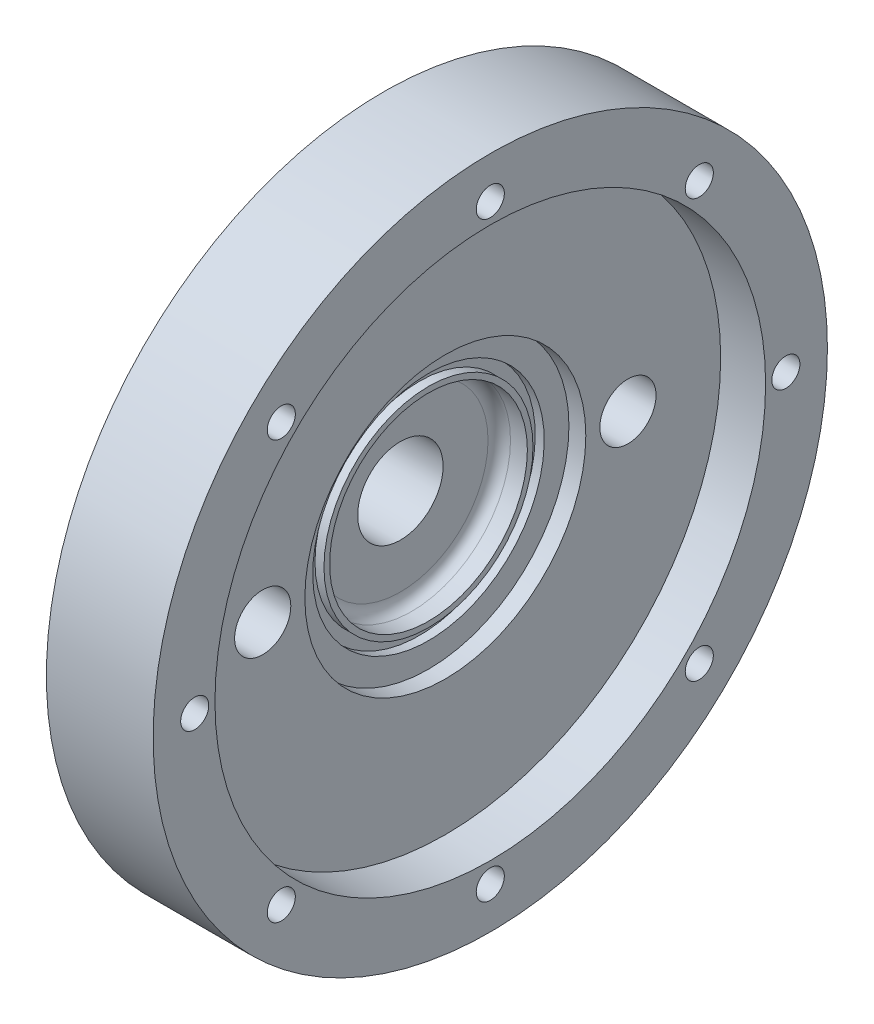
ISO-10303-21;
HEADER;
FILE_DESCRIPTION(('STEP AP214'),'2;1');
FILE_NAME('part.step','',(''),(''),'','','');
FILE_SCHEMA(('AUTOMOTIVE_DESIGN { 1 0 10303 214 1 1 1 1 }'));
ENDSEC;
DATA;
#1=APPLICATION_CONTEXT('core data for automotive mechanical design processes');
#2=APPLICATION_PROTOCOL_DEFINITION('international standard','automotive_design',2000,#1);
#3=PRODUCT_CONTEXT('',#1,'mechanical');
#4=PRODUCT('Part','Part','',(#3));
#5=PRODUCT_RELATED_PRODUCT_CATEGORY('part','',(#4));
#6=PRODUCT_DEFINITION_FORMATION('','',#4);
#7=PRODUCT_DEFINITION_CONTEXT('part definition',#1,'design');
#8=PRODUCT_DEFINITION('design','',#6,#7);
#9=PRODUCT_DEFINITION_SHAPE('','',#8);
#10=(LENGTH_UNIT() NAMED_UNIT(*) SI_UNIT(.MILLI.,.METRE.));
#11=(NAMED_UNIT(*) PLANE_ANGLE_UNIT() SI_UNIT($,.RADIAN.));
#12=(NAMED_UNIT(*) SI_UNIT($,.STERADIAN.) SOLID_ANGLE_UNIT());
#13=UNCERTAINTY_MEASURE_WITH_UNIT(LENGTH_MEASURE(1.E-05),#10,'distance_accuracy_value','');
#14=(GEOMETRIC_REPRESENTATION_CONTEXT(3) GLOBAL_UNCERTAINTY_ASSIGNED_CONTEXT((#13)) GLOBAL_UNIT_ASSIGNED_CONTEXT((#10,
#11,#12)) REPRESENTATION_CONTEXT('',''));
#15=CARTESIAN_POINT('',(0.,0.,0.));
#16=DIRECTION('',(0.,0.,1.));
#17=DIRECTION('',(1.,0.,0.));
#18=AXIS2_PLACEMENT_3D('',#15,#16,#17);
#19=CARTESIAN_POINT('',(3.81,0.,0.));
#20=DIRECTION('',(1.,0.,0.));
#21=DIRECTION('',(0.,0.,-1.));
#22=AXIS2_PLACEMENT_3D('',#19,#20,#21);
#23=PLANE('',#22);
#24=CARTESIAN_POINT('',(3.81,0.,-41.275));
#25=DIRECTION('',(1.,0.,0.));
#26=DIRECTION('',(0.,0.,-1.));
#27=AXIS2_PLACEMENT_3D('',#24,#25,#26);
#28=CIRCLE('',#27,6.35);
#29=CARTESIAN_POINT('',(3.81,0.,-47.625));
#30=VERTEX_POINT('',#29);
#31=EDGE_CURVE('E67',#30,#30,#28,.T.);
#32=ORIENTED_EDGE('',*,*,#31,.F.);
#33=EDGE_LOOP('',(#32));
#34=FACE_BOUND('',#33,.T.);
#35=CARTESIAN_POINT('',(3.81,0.,41.275));
#36=DIRECTION('',(1.,0.,0.));
#37=DIRECTION('',(0.,0.,-1.));
#38=AXIS2_PLACEMENT_3D('',#35,#36,#37);
#39=CIRCLE('',#38,6.35);
#40=CARTESIAN_POINT('',(3.81,0.,34.925));
#41=VERTEX_POINT('',#40);
#42=EDGE_CURVE('E51',#41,#41,#39,.T.);
#43=ORIENTED_EDGE('',*,*,#42,.F.);
#44=EDGE_LOOP('',(#43));
#45=FACE_BOUND('',#44,.T.);
#46=CARTESIAN_POINT('',(3.81,0.,0.));
#47=DIRECTION('',(1.,0.,0.));
#48=DIRECTION('',(0.,0.,-1.));
#49=AXIS2_PLACEMENT_3D('',#46,#47,#48);
#50=CIRCLE('',#49,31.75);
#51=CARTESIAN_POINT('',(3.81,0.,31.75));
#52=VERTEX_POINT('',#51);
#53=EDGE_CURVE('E77',#52,#52,#50,.T.);
#54=ORIENTED_EDGE('',*,*,#53,.F.);
#55=EDGE_LOOP('',(#54));
#56=FACE_BOUND('',#55,.T.);
#57=CARTESIAN_POINT('',(3.81,0.,0.));
#58=DIRECTION('',(1.,0.,0.));
#59=DIRECTION('',(0.,0.,-1.));
#60=AXIS2_PLACEMENT_3D('',#57,#58,#59);
#61=CIRCLE('',#60,62.23);
#62=CARTESIAN_POINT('',(3.81,0.,-62.23));
#63=VERTEX_POINT('',#62);
#64=EDGE_CURVE('E10',#63,#63,#61,.F.);
#65=ORIENTED_EDGE('',*,*,#64,.F.);
#66=EDGE_LOOP('',(#65));
#67=FACE_BOUND('',#66,.T.);
#68=ADVANCED_FACE('F33',(#34,#45,#56,#67),#23,.T.);
#69=CARTESIAN_POINT('',(0.,22.352,0.));
#70=DIRECTION('',(1.,0.,0.));
#71=DIRECTION('',(0.,0.,-1.));
#72=AXIS2_PLACEMENT_3D('',#69,#70,#71);
#73=PLANE('',#72);
#74=CARTESIAN_POINT('',(0.,0.,0.));
#75=DIRECTION('',(1.,0.,0.));
#76=DIRECTION('',(0.,1.,0.));
#77=AXIS2_PLACEMENT_3D('',#74,#75,#76);
#78=CIRCLE('',#77,26.162);
#79=CARTESIAN_POINT('',(0.,26.162,0.));
#80=VERTEX_POINT('',#79);
#81=EDGE_CURVE('E91',#80,#80,#78,.T.);
#82=ORIENTED_EDGE('',*,*,#81,.F.);
#83=EDGE_LOOP('',(#82));
#84=FACE_BOUND('',#83,.T.);
#85=CARTESIAN_POINT('',(0.,0.,0.));
#86=DIRECTION('',(1.,0.,0.));
#87=DIRECTION('',(0.,0.,-1.));
#88=AXIS2_PLACEMENT_3D('',#85,#86,#87);
#89=CIRCLE('',#88,31.75);
#90=CARTESIAN_POINT('',(0.,0.,31.75));
#91=VERTEX_POINT('',#90);
#92=EDGE_CURVE('E76',#91,#91,#89,.T.);
#93=ORIENTED_EDGE('',*,*,#92,.T.);
#94=EDGE_LOOP('',(#93));
#95=FACE_BOUND('',#94,.T.);
#96=ADVANCED_FACE('F35',(#84,#95),#73,.T.);
#97=CARTESIAN_POINT('',(0.,0.,0.));
#98=DIRECTION('',(1.,0.,0.));
#99=DIRECTION('',(0.,0.,-1.));
#100=AXIS2_PLACEMENT_3D('',#97,#98,#99);
#101=CIRCLE('',#100,22.352);
#102=CARTESIAN_POINT('',(0.,0.,-22.352));
#103=VERTEX_POINT('',#102);
#104=EDGE_CURVE('E41',#103,#103,#101,.T.);
#105=ORIENTED_EDGE('',*,*,#104,.F.);
#106=EDGE_LOOP('',(#105));
#107=FACE_BOUND('',#106,.T.);
#108=CARTESIAN_POINT('',(0.,0.,0.));
#109=DIRECTION('',(1.,0.,0.));
#110=DIRECTION('',(0.,1.,0.));
#111=AXIS2_PLACEMENT_3D('',#108,#109,#110);
#112=CIRCLE('',#111,23.622);
#113=CARTESIAN_POINT('',(0.,23.622,0.));
#114=VERTEX_POINT('',#113);
#115=EDGE_CURVE('E80',#114,#114,#112,.T.);
#116=ORIENTED_EDGE('',*,*,#115,.T.);
#117=EDGE_LOOP('',(#116));
#118=FACE_BOUND('',#117,.T.);
#119=ADVANCED_FACE('F122',(#107,#118),#73,.T.);
#120=CARTESIAN_POINT('',(0.,0.,0.));
#121=DIRECTION('',(1.,0.,0.));
#122=DIRECTION('',(0.,0.,-1.));
#123=AXIS2_PLACEMENT_3D('',#120,#121,#122);
#124=CYLINDRICAL_SURFACE('',#123,22.352);
#125=ORIENTED_EDGE('',*,*,#104,.T.);
#126=EDGE_LOOP('',(#125));
#127=FACE_BOUND('',#126,.T.);
#128=CARTESIAN_POINT('',(-3.81,0.,0.));
#129=DIRECTION('',(1.,0.,0.));
#130=DIRECTION('',(0.,0.,-1.));
#131=AXIS2_PLACEMENT_3D('',#128,#129,#130);
#132=CIRCLE('',#131,22.352);
#133=CARTESIAN_POINT('',(-3.81,0.,-22.352));
#134=VERTEX_POINT('',#133);
#135=EDGE_CURVE('E46',#134,#134,#132,.T.);
#136=ORIENTED_EDGE('',*,*,#135,.F.);
#137=EDGE_LOOP('',(#136));
#138=FACE_BOUND('',#137,.T.);
#139=ADVANCED_FACE('F120',(#127,#138),#124,.F.);
#140=CARTESIAN_POINT('',(-3.81,0.,0.));
#141=DIRECTION('',(1.,0.,0.));
#142=DIRECTION('',(0.,0.,-1.));
#143=AXIS2_PLACEMENT_3D('',#140,#141,#142);
#144=TOROIDAL_SURFACE('',#143,19.812,2.54);
#145=ORIENTED_EDGE('',*,*,#135,.T.);
#146=EDGE_LOOP('',(#145));
#147=FACE_BOUND('',#146,.T.);
#148=CARTESIAN_POINT('',(-6.35,0.,0.));
#149=DIRECTION('',(1.,0.,0.));
#150=DIRECTION('',(0.,0.,-1.));
#151=AXIS2_PLACEMENT_3D('',#148,#149,#150);
#152=CIRCLE('',#151,19.812);
#153=CARTESIAN_POINT('',(-6.35,0.,-19.812));
#154=VERTEX_POINT('',#153);
#155=EDGE_CURVE('E112',#154,#154,#152,.T.);
#156=ORIENTED_EDGE('',*,*,#155,.F.);
#157=EDGE_LOOP('',(#156));
#158=FACE_BOUND('',#157,.T.);
#159=ADVANCED_FACE('F117',(#147,#158),#144,.F.);
#160=CARTESIAN_POINT('',(-6.35,9.652,0.));
#161=DIRECTION('',(1.,0.,0.));
#162=DIRECTION('',(0.,0.,-1.));
#163=AXIS2_PLACEMENT_3D('',#160,#161,#162);
#164=PLANE('',#163);
#165=ORIENTED_EDGE('',*,*,#155,.T.);
#166=EDGE_LOOP('',(#165));
#167=FACE_BOUND('',#166,.T.);
#168=CARTESIAN_POINT('',(-6.35,0.,0.));
#169=DIRECTION('',(1.,0.,0.));
#170=DIRECTION('',(0.,0.,-1.));
#171=AXIS2_PLACEMENT_3D('',#168,#169,#170);
#172=CIRCLE('',#171,9.652);
#173=CARTESIAN_POINT('',(-6.35,0.,-9.652));
#174=VERTEX_POINT('',#173);
#175=EDGE_CURVE('E109',#174,#174,#172,.T.);
#176=ORIENTED_EDGE('',*,*,#175,.F.);
#177=EDGE_LOOP('',(#176));
#178=FACE_BOUND('',#177,.T.);
#179=ADVANCED_FACE('F128',(#167,#178),#164,.T.);
#180=CARTESIAN_POINT('',(0.,0.,0.));
#181=DIRECTION('',(1.,0.,0.));
#182=DIRECTION('',(0.,0.,-1.));
#183=AXIS2_PLACEMENT_3D('',#180,#181,#182);
#184=CYLINDRICAL_SURFACE('',#183,9.652);
#185=ORIENTED_EDGE('',*,*,#175,.T.);
#186=EDGE_LOOP('',(#185));
#187=FACE_BOUND('',#186,.T.);
#188=CARTESIAN_POINT('',(-31.75,0.,0.));
#189=DIRECTION('',(1.,0.,0.));
#190=DIRECTION('',(0.,0.,-1.));
#191=AXIS2_PLACEMENT_3D('',#188,#189,#190);
#192=CIRCLE('',#191,9.652);
#193=CARTESIAN_POINT('',(-31.75,0.,-9.652));
#194=VERTEX_POINT('',#193);
#195=EDGE_CURVE('E106',#194,#194,#192,.T.);
#196=ORIENTED_EDGE('',*,*,#195,.F.);
#197=EDGE_LOOP('',(#196));
#198=FACE_BOUND('',#197,.T.);
#199=ADVANCED_FACE('F175',(#187,#198),#184,.F.);
#200=CARTESIAN_POINT('',(-31.75,16.002,0.));
#201=DIRECTION('',(-1.,0.,0.));
#202=DIRECTION('',(0.,0.,1.));
#203=AXIS2_PLACEMENT_3D('',#200,#201,#202);
#204=PLANE('',#203);
#205=ORIENTED_EDGE('',*,*,#195,.T.);
#206=EDGE_LOOP('',(#205));
#207=FACE_BOUND('',#206,.T.);
#208=CARTESIAN_POINT('',(-31.75,0.,0.));
#209=DIRECTION('',(1.,0.,0.));
#210=DIRECTION('',(0.,0.,-1.));
#211=AXIS2_PLACEMENT_3D('',#208,#209,#210);
#212=CIRCLE('',#211,16.002);
#213=CARTESIAN_POINT('',(-31.75,0.,-16.002));
#214=VERTEX_POINT('',#213);
#215=EDGE_CURVE('E103',#214,#214,#212,.T.);
#216=ORIENTED_EDGE('',*,*,#215,.F.);
#217=EDGE_LOOP('',(#216));
#218=FACE_BOUND('',#217,.T.);
#219=ADVANCED_FACE('F171',(#207,#218),#204,.T.);
#220=CARTESIAN_POINT('',(0.,0.,0.));
#221=DIRECTION('',(1.,0.,0.));
#222=DIRECTION('',(0.,0.,-1.));
#223=AXIS2_PLACEMENT_3D('',#220,#221,#222);
#224=CYLINDRICAL_SURFACE('',#223,16.002);
#225=ORIENTED_EDGE('',*,*,#215,.T.);
#226=EDGE_LOOP('',(#225));
#227=FACE_BOUND('',#226,.T.);
#228=CARTESIAN_POINT('',(-15.24,0.,0.));
#229=DIRECTION('',(1.,0.,0.));
#230=DIRECTION('',(0.,0.,-1.));
#231=AXIS2_PLACEMENT_3D('',#228,#229,#230);
#232=CIRCLE('',#231,16.002);
#233=CARTESIAN_POINT('',(-15.24,0.,-16.002));
#234=VERTEX_POINT('',#233);
#235=EDGE_CURVE('E100',#234,#234,#232,.T.);
#236=ORIENTED_EDGE('',*,*,#235,.F.);
#237=EDGE_LOOP('',(#236));
#238=FACE_BOUND('',#237,.T.);
#239=ADVANCED_FACE('F167',(#227,#238),#224,.T.);
#240=CARTESIAN_POINT('',(-15.24,0.,0.));
#241=DIRECTION('',(1.,0.,0.));
#242=DIRECTION('',(0.,0.,-1.));
#243=AXIS2_PLACEMENT_3D('',#240,#241,#242);
#244=TOROIDAL_SURFACE('',#243,21.082,5.08);
#245=ORIENTED_EDGE('',*,*,#235,.T.);
#246=EDGE_LOOP('',(#245));
#247=FACE_BOUND('',#246,.T.);
#248=CARTESIAN_POINT('',(-10.16,0.,0.));
#249=DIRECTION('',(1.,0.,0.));
#250=DIRECTION('',(0.,0.,-1.));
#251=AXIS2_PLACEMENT_3D('',#248,#249,#250);
#252=CIRCLE('',#251,21.082);
#253=CARTESIAN_POINT('',(-10.16,0.,-21.082));
#254=VERTEX_POINT('',#253);
#255=EDGE_CURVE('E97',#254,#254,#252,.T.);
#256=ORIENTED_EDGE('',*,*,#255,.F.);
#257=EDGE_LOOP('',(#256));
#258=FACE_BOUND('',#257,.T.);
#259=ADVANCED_FACE('F163',(#247,#258),#244,.F.);
#260=CARTESIAN_POINT('',(-10.16,76.2,0.));
#261=DIRECTION('',(-1.,0.,0.));
#262=DIRECTION('',(0.,0.,1.));
#263=AXIS2_PLACEMENT_3D('',#260,#261,#262);
#264=PLANE('',#263);
#265=CARTESIAN_POINT('',(-10.16,66.802,2.33237936397399E-13));
#266=DIRECTION('',(-1.,0.,0.));
#267=DIRECTION('',(0.,0.,1.));
#268=AXIS2_PLACEMENT_3D('',#265,#266,#267);
#269=CIRCLE('',#268,3.175);
#270=CARTESIAN_POINT('',(-10.16,66.802,3.17500000000023));
#271=VERTEX_POINT('',#270);
#272=EDGE_CURVE('E63',#271,#271,#269,.T.);
#273=ORIENTED_EDGE('',*,*,#272,.F.);
#274=EDGE_LOOP('',(#273));
#275=FACE_BOUND('',#274,.T.);
#276=CARTESIAN_POINT('',(-10.16,47.2361471968235,47.236147196824));
#277=DIRECTION('',(-1.,0.,0.));
#278=DIRECTION('',(0.,0.,1.));
#279=AXIS2_PLACEMENT_3D('',#276,#277,#278);
#280=CIRCLE('',#279,3.175);
#281=CARTESIAN_POINT('',(-10.16,47.2361471968235,50.411147196824));
#282=VERTEX_POINT('',#281);
#283=EDGE_CURVE('E294',#282,#282,#280,.T.);
#284=ORIENTED_EDGE('',*,*,#283,.F.);
#285=EDGE_LOOP('',(#284));
#286=FACE_BOUND('',#285,.T.);
#287=CARTESIAN_POINT('',(-10.16,0.,66.802));
#288=DIRECTION('',(-1.,0.,0.));
#289=DIRECTION('',(0.,0.,1.));
#290=AXIS2_PLACEMENT_3D('',#287,#288,#289);
#291=CIRCLE('',#290,3.175);
#292=CARTESIAN_POINT('',(-10.16,0.,69.977));
#293=VERTEX_POINT('',#292);
#294=EDGE_CURVE('E291',#293,#293,#291,.T.);
#295=ORIENTED_EDGE('',*,*,#294,.F.);
#296=EDGE_LOOP('',(#295));
#297=FACE_BOUND('',#296,.T.);
#298=CARTESIAN_POINT('',(-10.16,-47.2361471968242,47.2361471968233));
#299=DIRECTION('',(-1.,0.,0.));
#300=DIRECTION('',(0.,0.,1.));
#301=AXIS2_PLACEMENT_3D('',#298,#299,#300);
#302=CIRCLE('',#301,3.175);
#303=CARTESIAN_POINT('',(-10.16,-47.2361471968242,50.4111471968233));
#304=VERTEX_POINT('',#303);
#305=EDGE_CURVE('E288',#304,#304,#302,.T.);
#306=ORIENTED_EDGE('',*,*,#305,.F.);
#307=EDGE_LOOP('',(#306));
#308=FACE_BOUND('',#307,.T.);
#309=CARTESIAN_POINT('',(-10.16,-66.802,-6.99713809192197E-13));
#310=DIRECTION('',(-1.,0.,0.));
#311=DIRECTION('',(0.,0.,1.));
#312=AXIS2_PLACEMENT_3D('',#309,#310,#311);
#313=CIRCLE('',#312,3.175);
#314=CARTESIAN_POINT('',(-10.16,-66.802,3.1749999999993));
#315=VERTEX_POINT('',#314);
#316=EDGE_CURVE('E256',#315,#315,#313,.T.);
#317=ORIENTED_EDGE('',*,*,#316,.F.);
#318=EDGE_LOOP('',(#317));
#319=FACE_BOUND('',#318,.T.);
#320=CARTESIAN_POINT('',(-10.16,-47.2361471968232,-47.2361471968243));
#321=DIRECTION('',(-1.,0.,0.));
#322=DIRECTION('',(0.,0.,1.));
#323=AXIS2_PLACEMENT_3D('',#320,#321,#322);
#324=CIRCLE('',#323,3.175);
#325=CARTESIAN_POINT('',(-10.16,-47.2361471968232,-44.0611471968243));
#326=VERTEX_POINT('',#325);
#327=EDGE_CURVE('E284',#326,#326,#324,.T.);
#328=ORIENTED_EDGE('',*,*,#327,.F.);
#329=EDGE_LOOP('',(#328));
#330=FACE_BOUND('',#329,.T.);
#331=CARTESIAN_POINT('',(-10.16,47.2361471968238,-47.2361471968237));
#332=DIRECTION('',(-1.,0.,0.));
#333=DIRECTION('',(0.,0.,1.));
#334=AXIS2_PLACEMENT_3D('',#331,#332,#333);
#335=CIRCLE('',#334,3.175);
#336=CARTESIAN_POINT('',(-10.16,47.2361471968238,-44.0611471968237));
#337=VERTEX_POINT('',#336);
#338=EDGE_CURVE('E281',#337,#337,#335,.T.);
#339=ORIENTED_EDGE('',*,*,#338,.F.);
#340=EDGE_LOOP('',(#339));
#341=FACE_BOUND('',#340,.T.);
#342=CARTESIAN_POINT('',(-10.16,0.,-66.802));
#343=DIRECTION('',(-1.,0.,0.));
#344=DIRECTION('',(0.,0.,1.));
#345=AXIS2_PLACEMENT_3D('',#342,#343,#344);
#346=CIRCLE('',#345,3.175);
#347=CARTESIAN_POINT('',(-10.16,0.,-63.627));
#348=VERTEX_POINT('',#347);
#349=EDGE_CURVE('E52',#348,#348,#346,.T.);
#350=ORIENTED_EDGE('',*,*,#349,.F.);
#351=EDGE_LOOP('',(#350));
#352=FACE_BOUND('',#351,.T.);
#353=CARTESIAN_POINT('',(-10.16,0.,-41.275));
#354=DIRECTION('',(-1.,0.,0.));
#355=DIRECTION('',(0.,0.,1.));
#356=AXIS2_PLACEMENT_3D('',#353,#354,#355);
#357=CIRCLE('',#356,6.35);
#358=CARTESIAN_POINT('',(-10.16,0.,-34.925));
#359=VERTEX_POINT('',#358);
#360=EDGE_CURVE('E37',#359,#359,#357,.T.);
#361=ORIENTED_EDGE('',*,*,#360,.F.);
#362=EDGE_LOOP('',(#361));
#363=FACE_BOUND('',#362,.T.);
#364=CARTESIAN_POINT('',(-10.16,0.,41.275));
#365=DIRECTION('',(-1.,0.,0.));
#366=DIRECTION('',(0.,0.,1.));
#367=AXIS2_PLACEMENT_3D('',#364,#365,#366);
#368=CIRCLE('',#367,6.35);
#369=CARTESIAN_POINT('',(-10.16,0.,47.625));
#370=VERTEX_POINT('',#369);
#371=EDGE_CURVE('E49',#370,#370,#368,.T.);
#372=ORIENTED_EDGE('',*,*,#371,.F.);
#373=EDGE_LOOP('',(#372));
#374=FACE_BOUND('',#373,.T.);
#375=ORIENTED_EDGE('',*,*,#255,.T.);
#376=EDGE_LOOP('',(#375));
#377=FACE_BOUND('',#376,.T.);
#378=CARTESIAN_POINT('',(-10.16,0.,0.));
#379=DIRECTION('',(1.,0.,0.));
#380=DIRECTION('',(0.,0.,-1.));
#381=AXIS2_PLACEMENT_3D('',#378,#379,#380);
#382=CIRCLE('',#381,76.2);
#383=CARTESIAN_POINT('',(-10.16,0.,-76.2));
#384=VERTEX_POINT('',#383);
#385=EDGE_CURVE('E94',#384,#384,#382,.T.);
#386=ORIENTED_EDGE('',*,*,#385,.F.);
#387=EDGE_LOOP('',(#386));
#388=FACE_BOUND('',#387,.T.);
#389=ADVANCED_FACE('F159',(#275,#286,#297,#308,#319,#330,#341,#352,#363,#374,#377,#388),#264,.T.);
#390=CARTESIAN_POINT('',(0.,0.,0.));
#391=DIRECTION('',(1.,0.,0.));
#392=DIRECTION('',(0.,0.,-1.));
#393=AXIS2_PLACEMENT_3D('',#390,#391,#392);
#394=CYLINDRICAL_SURFACE('',#393,76.2);
#395=ORIENTED_EDGE('',*,*,#385,.T.);
#396=EDGE_LOOP('',(#395));
#397=FACE_BOUND('',#396,.T.);
#398=CARTESIAN_POINT('',(13.97,0.,0.));
#399=DIRECTION('',(1.,0.,0.));
#400=DIRECTION('',(0.,0.,-1.));
#401=AXIS2_PLACEMENT_3D('',#398,#399,#400);
#402=CIRCLE('',#401,76.2);
#403=CARTESIAN_POINT('',(13.97,0.,-76.2));
#404=VERTEX_POINT('',#403);
#405=EDGE_CURVE('E73',#404,#404,#402,.T.);
#406=ORIENTED_EDGE('',*,*,#405,.F.);
#407=EDGE_LOOP('',(#406));
#408=FACE_BOUND('',#407,.T.);
#409=ADVANCED_FACE('F155',(#397,#408),#394,.T.);
#410=CARTESIAN_POINT('',(0.,0.,0.));
#411=DIRECTION('',(1.,0.,0.));
#412=DIRECTION('',(0.,1.,0.));
#413=AXIS2_PLACEMENT_3D('',#410,#411,#412);
#414=CYLINDRICAL_SURFACE('',#413,26.162);
#415=CARTESIAN_POINT('',(-2.03200000000002,0.,0.));
#416=DIRECTION('',(1.,0.,0.));
#417=DIRECTION('',(0.,1.,0.));
#418=AXIS2_PLACEMENT_3D('',#415,#416,#417);
#419=CIRCLE('',#418,26.162);
#420=CARTESIAN_POINT('',(-2.032,26.162,0.));
#421=VERTEX_POINT('',#420);
#422=EDGE_CURVE('E88',#421,#421,#419,.T.);
#423=ORIENTED_EDGE('',*,*,#422,.F.);
#424=EDGE_LOOP('',(#423));
#425=FACE_BOUND('',#424,.T.);
#426=ORIENTED_EDGE('',*,*,#81,.T.);
#427=EDGE_LOOP('',(#426));
#428=FACE_BOUND('',#427,.T.);
#429=ADVANCED_FACE('F151',(#425,#428),#414,.F.);
#430=CARTESIAN_POINT('',(-2.032,23.622,0.));
#431=DIRECTION('',(-1.,0.,0.));
#432=DIRECTION('',(0.,-1.,0.));
#433=AXIS2_PLACEMENT_3D('',#430,#431,#432);
#434=PLANE('',#433);
#435=CARTESIAN_POINT('',(-2.03200000000002,0.,0.));
#436=DIRECTION('',(1.,0.,0.));
#437=DIRECTION('',(0.,1.,0.));
#438=AXIS2_PLACEMENT_3D('',#435,#436,#437);
#439=CIRCLE('',#438,23.622);
#440=CARTESIAN_POINT('',(-2.032,23.622,0.));
#441=VERTEX_POINT('',#440);
#442=EDGE_CURVE('E85',#441,#441,#439,.T.);
#443=ORIENTED_EDGE('',*,*,#442,.F.);
#444=EDGE_LOOP('',(#443));
#445=FACE_BOUND('',#444,.T.);
#446=ORIENTED_EDGE('',*,*,#422,.T.);
#447=EDGE_LOOP('',(#446));
#448=FACE_BOUND('',#447,.T.);
#449=ADVANCED_FACE('F147',(#445,#448),#434,.F.);
#450=CARTESIAN_POINT('',(0.,0.,0.));
#451=DIRECTION('',(1.,0.,0.));
#452=DIRECTION('',(0.,1.,0.));
#453=AXIS2_PLACEMENT_3D('',#450,#451,#452);
#454=CYLINDRICAL_SURFACE('',#453,23.622);
#455=ORIENTED_EDGE('',*,*,#115,.F.);
#456=EDGE_LOOP('',(#455));
#457=FACE_BOUND('',#456,.T.);
#458=ORIENTED_EDGE('',*,*,#442,.T.);
#459=EDGE_LOOP('',(#458));
#460=FACE_BOUND('',#459,.T.);
#461=ADVANCED_FACE('F144',(#457,#460),#454,.T.);
#462=CARTESIAN_POINT('',(3.81,0.,0.));
#463=DIRECTION('',(-1.,0.,0.));
#464=DIRECTION('',(0.,0.,1.));
#465=AXIS2_PLACEMENT_3D('',#462,#463,#464);
#466=CYLINDRICAL_SURFACE('',#465,31.75);
#467=CARTESIAN_POINT('',(3.81,0.,31.75));
#468=CARTESIAN_POINT('',(3.7703125,0.,31.75));
#469=CARTESIAN_POINT('',(3.730625,0.,31.75));
#470=CARTESIAN_POINT('',(3.65125,0.,31.75));
#471=CARTESIAN_POINT('',(3.6115625,0.,31.75));
#472=CARTESIAN_POINT('',(3.5321875,0.,31.75));
#473=CARTESIAN_POINT('',(3.4925,0.,31.75));
#474=CARTESIAN_POINT('',(3.413125,0.,31.75));
#475=CARTESIAN_POINT('',(3.3734375,0.,31.75));
#476=CARTESIAN_POINT('',(3.2940625,0.,31.75));
#477=CARTESIAN_POINT('',(3.254375,0.,31.75));
#478=CARTESIAN_POINT('',(3.175,0.,31.75));
#479=CARTESIAN_POINT('',(3.1353125,0.,31.75));
#480=CARTESIAN_POINT('',(3.0559375,0.,31.75));
#481=CARTESIAN_POINT('',(3.01625,0.,31.75));
#482=CARTESIAN_POINT('',(2.936875,0.,31.75));
#483=CARTESIAN_POINT('',(2.8971875,0.,31.75));
#484=CARTESIAN_POINT('',(2.8178125,0.,31.75));
#485=CARTESIAN_POINT('',(2.778125,0.,31.75));
#486=CARTESIAN_POINT('',(2.69875,0.,31.75));
#487=CARTESIAN_POINT('',(2.6590625,0.,31.75));
#488=CARTESIAN_POINT('',(2.5796875,0.,31.75));
#489=CARTESIAN_POINT('',(2.54,0.,31.75));
#490=CARTESIAN_POINT('',(2.460625,0.,31.75));
#491=CARTESIAN_POINT('',(2.4209375,0.,31.75));
#492=CARTESIAN_POINT('',(2.3415625,0.,31.75));
#493=CARTESIAN_POINT('',(2.301875,0.,31.75));
#494=CARTESIAN_POINT('',(2.2225,0.,31.75));
#495=CARTESIAN_POINT('',(2.1828125,0.,31.75));
#496=CARTESIAN_POINT('',(2.1034375,0.,31.75));
#497=CARTESIAN_POINT('',(2.06375,0.,31.75));
#498=CARTESIAN_POINT('',(1.984375,0.,31.75));
#499=CARTESIAN_POINT('',(1.9446875,0.,31.75));
#500=CARTESIAN_POINT('',(1.8653125,0.,31.75));
#501=CARTESIAN_POINT('',(1.825625,0.,31.75));
#502=CARTESIAN_POINT('',(1.74625,0.,31.75));
#503=CARTESIAN_POINT('',(1.7065625,0.,31.75));
#504=CARTESIAN_POINT('',(1.6271875,0.,31.75));
#505=CARTESIAN_POINT('',(1.5875,0.,31.75));
#506=CARTESIAN_POINT('',(1.508125,0.,31.75));
#507=CARTESIAN_POINT('',(1.4684375,0.,31.75));
#508=CARTESIAN_POINT('',(1.3890625,0.,31.75));
#509=CARTESIAN_POINT('',(1.349375,0.,31.75));
#510=CARTESIAN_POINT('',(1.27,0.,31.75));
#511=CARTESIAN_POINT('',(1.2303125,0.,31.75));
#512=CARTESIAN_POINT('',(1.1509375,0.,31.75));
#513=CARTESIAN_POINT('',(1.11125,0.,31.75));
#514=CARTESIAN_POINT('',(1.031875,0.,31.75));
#515=CARTESIAN_POINT('',(0.9921875,0.,31.75));
#516=CARTESIAN_POINT('',(0.9128125,0.,31.75));
#517=CARTESIAN_POINT('',(0.873125,0.,31.75));
#518=CARTESIAN_POINT('',(0.79375,0.,31.75));
#519=CARTESIAN_POINT('',(0.7540625,0.,31.75));
#520=CARTESIAN_POINT('',(0.6746875,0.,31.75));
#521=CARTESIAN_POINT('',(0.635,0.,31.75));
#522=CARTESIAN_POINT('',(0.555625,0.,31.75));
#523=CARTESIAN_POINT('',(0.5159375,0.,31.75));
#524=CARTESIAN_POINT('',(0.4365625,0.,31.75));
#525=CARTESIAN_POINT('',(0.396875,0.,31.75));
#526=CARTESIAN_POINT('',(0.3175,0.,31.75));
#527=CARTESIAN_POINT('',(0.2778125,0.,31.75));
#528=CARTESIAN_POINT('',(0.1984375,0.,31.75));
#529=CARTESIAN_POINT('',(0.15875,0.,31.75));
#530=CARTESIAN_POINT('',(0.0793749999999999,0.,31.75));
#531=CARTESIAN_POINT('',(0.0396874999999999,0.,31.75));
#532=CARTESIAN_POINT('',(0.,0.,31.75));
#533=B_SPLINE_CURVE_WITH_KNOTS('',3,(#467,#468,#469,#470,#471,#472,#473,#474,#475,#476,#477,
#478,#479,#480,#481,#482,#483,#484,#485,#486,#487,#488,#489,#490,#491,#492,#493,#494,#495,#496,
#497,#498,#499,#500,#501,#502,#503,#504,#505,#506,#507,#508,#509,#510,#511,#512,#513,#514,#515,
#516,#517,#518,#519,#520,#521,#522,#523,#524,#525,#526,#527,#528,#529,#530,#531,#532),
.UNSPECIFIED.,.F.,.F.,(4,2,2,2,2,2,2,2,2,2,2,2,2,2,2,2,2,2,2,2,2,2,2,2,2,2,2,2,2,2,2,2,4),(0.,
0.1190625,0.238125,0.3571875,0.47625,0.595312499999999,0.714375,0.833437499999999,
0.952499999999999,1.0715625,1.190625,1.3096875,1.42875,1.5478125,1.666875,1.7859375,1.905,
2.0240625,2.143125,2.2621875,2.38125,2.5003125,2.619375,2.7384375,2.8575,2.9765625,3.095625,
3.2146875,3.33375,3.4528125,3.571875,3.6909375,3.81),.UNSPECIFIED.);
#534=EDGE_CURVE('BSEAM142',#52,#91,#533,.T.);
#535=ORIENTED_EDGE('',*,*,#53,.T.);
#536=ORIENTED_EDGE('',*,*,#92,.F.);
#537=ORIENTED_EDGE('',*,*,#534,.T.);
#538=ORIENTED_EDGE('',*,*,#534,.F.);
#539=EDGE_LOOP('',(#535,#537,#536,#538));
#540=FACE_BOUND('',#539,.T.);
#541=ADVANCED_FACE('F142',(#540),#466,.F.);
#542=CARTESIAN_POINT('',(13.97,0.,0.));
#543=DIRECTION('',(1.,0.,0.));
#544=DIRECTION('',(0.,0.,-1.));
#545=AXIS2_PLACEMENT_3D('',#542,#543,#544);
#546=PLANE('',#545);
#547=CARTESIAN_POINT('',(13.97,66.802,2.33237936397399E-13));
#548=DIRECTION('',(1.,0.,0.));
#549=DIRECTION('',(0.,1.,0.));
#550=AXIS2_PLACEMENT_3D('',#547,#548,#549);
#551=CIRCLE('',#550,3.175);
#552=CARTESIAN_POINT('',(13.97,69.977,2.44323389648226E-13));
#553=VERTEX_POINT('',#552);
#554=EDGE_CURVE('E270',#553,#553,#551,.T.);
#555=ORIENTED_EDGE('',*,*,#554,.F.);
#556=EDGE_LOOP('',(#555));
#557=FACE_BOUND('',#556,.T.);
#558=CARTESIAN_POINT('',(13.97,47.2361471968235,47.236147196824));
#559=DIRECTION('',(1.,0.,0.));
#560=DIRECTION('',(0.,0.707106781186544,0.707106781186551));
#561=AXIS2_PLACEMENT_3D('',#558,#559,#560);
#562=CIRCLE('',#561,3.175);
#563=CARTESIAN_POINT('',(13.97,49.4812112270908,49.4812112270913));
#564=VERTEX_POINT('',#563);
#565=EDGE_CURVE('E274',#564,#564,#562,.T.);
#566=ORIENTED_EDGE('',*,*,#565,.F.);
#567=EDGE_LOOP('',(#566));
#568=FACE_BOUND('',#567,.T.);
#569=CARTESIAN_POINT('',(13.97,0.,66.802));
#570=DIRECTION('',(1.,0.,0.));
#571=DIRECTION('',(0.,0.,1.));
#572=AXIS2_PLACEMENT_3D('',#569,#570,#571);
#573=CIRCLE('',#572,3.175);
#574=CARTESIAN_POINT('',(13.97,0.,69.977));
#575=VERTEX_POINT('',#574);
#576=EDGE_CURVE('E265',#575,#575,#573,.T.);
#577=ORIENTED_EDGE('',*,*,#576,.F.);
#578=EDGE_LOOP('',(#577));
#579=FACE_BOUND('',#578,.T.);
#580=CARTESIAN_POINT('',(13.97,-47.2361471968242,47.2361471968233));
#581=DIRECTION('',(1.,0.,0.));
#582=DIRECTION('',(0.,-0.707106781186554,0.707106781186541));
#583=AXIS2_PLACEMENT_3D('',#580,#581,#582);
#584=CIRCLE('',#583,3.175);
#585=CARTESIAN_POINT('',(13.97,-49.4812112270915,49.4812112270906));
#586=VERTEX_POINT('',#585);
#587=EDGE_CURVE('E261',#586,#586,#584,.T.);
#588=ORIENTED_EDGE('',*,*,#587,.F.);
#589=EDGE_LOOP('',(#588));
#590=FACE_BOUND('',#589,.T.);
#591=CARTESIAN_POINT('',(13.97,-66.802,-6.99713809192197E-13));
#592=DIRECTION('',(1.,0.,0.));
#593=DIRECTION('',(0.,-1.,0.));
#594=AXIS2_PLACEMENT_3D('',#591,#592,#593);
#595=CIRCLE('',#594,3.175);
#596=CARTESIAN_POINT('',(13.97,-69.977,-7.32970168944678E-13));
#597=VERTEX_POINT('',#596);
#598=EDGE_CURVE('E259',#597,#597,#595,.T.);
#599=ORIENTED_EDGE('',*,*,#598,.F.);
#600=EDGE_LOOP('',(#599));
#601=FACE_BOUND('',#600,.T.);
#602=CARTESIAN_POINT('',(13.97,-47.2361471968232,-47.2361471968243));
#603=DIRECTION('',(1.,0.,0.));
#604=DIRECTION('',(0.,-0.707106781186539,-0.707106781186556));
#605=AXIS2_PLACEMENT_3D('',#602,#603,#604);
#606=CIRCLE('',#605,3.175);
#607=CARTESIAN_POINT('',(13.97,-49.4812112270904,-49.4812112270916));
#608=VERTEX_POINT('',#607);
#609=EDGE_CURVE('E262',#608,#608,#606,.T.);
#610=ORIENTED_EDGE('',*,*,#609,.F.);
#611=EDGE_LOOP('',(#610));
#612=FACE_BOUND('',#611,.T.);
#613=CARTESIAN_POINT('',(13.97,47.2361471968238,-47.2361471968237));
#614=DIRECTION('',(1.,0.,0.));
#615=DIRECTION('',(0.,0.707106781186549,-0.707106781186546));
#616=AXIS2_PLACEMENT_3D('',#613,#614,#615);
#617=CIRCLE('',#616,3.175);
#618=CARTESIAN_POINT('',(13.97,49.4812112270911,-49.481211227091));
#619=VERTEX_POINT('',#618);
#620=EDGE_CURVE('E273',#619,#619,#617,.T.);
#621=ORIENTED_EDGE('',*,*,#620,.F.);
#622=EDGE_LOOP('',(#621));
#623=FACE_BOUND('',#622,.T.);
#624=CARTESIAN_POINT('',(13.97,0.,-66.802));
#625=DIRECTION('',(1.,0.,0.));
#626=DIRECTION('',(0.,0.,-1.));
#627=AXIS2_PLACEMENT_3D('',#624,#625,#626);
#628=CIRCLE('',#627,3.175);
#629=CARTESIAN_POINT('',(13.97,0.,-69.977));
#630=VERTEX_POINT('',#629);
#631=EDGE_CURVE('E58',#630,#630,#628,.T.);
#632=ORIENTED_EDGE('',*,*,#631,.F.);
#633=EDGE_LOOP('',(#632));
#634=FACE_BOUND('',#633,.T.);
#635=ORIENTED_EDGE('',*,*,#405,.T.);
#636=EDGE_LOOP('',(#635));
#637=FACE_BOUND('',#636,.T.);
#638=CARTESIAN_POINT('',(13.97,0.,0.));
#639=DIRECTION('',(1.,0.,0.));
#640=DIRECTION('',(0.,0.,-1.));
#641=AXIS2_PLACEMENT_3D('',#638,#639,#640);
#642=CIRCLE('',#641,62.23);
#643=CARTESIAN_POINT('',(13.97,0.,-62.23));
#644=VERTEX_POINT('',#643);
#645=EDGE_CURVE('E70',#644,#644,#642,.T.);
#646=ORIENTED_EDGE('',*,*,#645,.F.);
#647=EDGE_LOOP('',(#646));
#648=FACE_BOUND('',#647,.T.);
#649=ADVANCED_FACE('F201',(#557,#568,#579,#590,#601,#612,#623,#634,#637,#648),#546,.T.);
#650=CARTESIAN_POINT('',(13.97,0.,0.));
#651=DIRECTION('',(-1.,0.,0.));
#652=DIRECTION('',(0.,0.,1.));
#653=AXIS2_PLACEMENT_3D('',#650,#651,#652);
#654=CYLINDRICAL_SURFACE('',#653,62.23);
#655=ORIENTED_EDGE('',*,*,#645,.T.);
#656=EDGE_LOOP('',(#655));
#657=FACE_BOUND('',#656,.T.);
#658=ORIENTED_EDGE('',*,*,#64,.T.);
#659=EDGE_LOOP('',(#658));
#660=FACE_BOUND('',#659,.T.);
#661=ADVANCED_FACE('F204',(#657,#660),#654,.F.);
#662=CARTESIAN_POINT('',(-31.75,0.,41.275));
#663=DIRECTION('',(1.,0.,0.));
#664=DIRECTION('',(0.,0.,-1.));
#665=AXIS2_PLACEMENT_3D('',#662,#663,#664);
#666=CYLINDRICAL_SURFACE('',#665,6.35);
#667=ORIENTED_EDGE('',*,*,#42,.T.);
#668=EDGE_LOOP('',(#667));
#669=FACE_BOUND('',#668,.T.);
#670=ORIENTED_EDGE('',*,*,#371,.T.);
#671=EDGE_LOOP('',(#670));
#672=FACE_BOUND('',#671,.T.);
#673=ADVANCED_FACE('F209',(#669,#672),#666,.F.);
#674=CARTESIAN_POINT('',(-31.75,0.,-41.275));
#675=DIRECTION('',(1.,0.,0.));
#676=DIRECTION('',(0.,0.,-1.));
#677=AXIS2_PLACEMENT_3D('',#674,#675,#676);
#678=CYLINDRICAL_SURFACE('',#677,6.35);
#679=ORIENTED_EDGE('',*,*,#31,.T.);
#680=EDGE_LOOP('',(#679));
#681=FACE_BOUND('',#680,.T.);
#682=ORIENTED_EDGE('',*,*,#360,.T.);
#683=EDGE_LOOP('',(#682));
#684=FACE_BOUND('',#683,.T.);
#685=ADVANCED_FACE('F214',(#681,#684),#678,.F.);
#686=CARTESIAN_POINT('',(-31.75,0.,-66.802));
#687=DIRECTION('',(1.,0.,0.));
#688=DIRECTION('',(0.,0.,-1.));
#689=AXIS2_PLACEMENT_3D('',#686,#687,#688);
#690=CYLINDRICAL_SURFACE('',#689,3.175);
#691=ORIENTED_EDGE('',*,*,#349,.T.);
#692=EDGE_LOOP('',(#691));
#693=FACE_BOUND('',#692,.T.);
#694=ORIENTED_EDGE('',*,*,#631,.T.);
#695=EDGE_LOOP('',(#694));
#696=FACE_BOUND('',#695,.T.);
#697=ADVANCED_FACE('F220',(#693,#696),#690,.F.);
#698=CARTESIAN_POINT('',(-31.75,47.2361471968238,-47.2361471968237));
#699=DIRECTION('',(1.,0.,0.));
#700=DIRECTION('',(0.,0.,-1.));
#701=AXIS2_PLACEMENT_3D('',#698,#699,#700);
#702=CYLINDRICAL_SURFACE('',#701,3.175);
#703=ORIENTED_EDGE('',*,*,#338,.T.);
#704=EDGE_LOOP('',(#703));
#705=FACE_BOUND('',#704,.T.);
#706=ORIENTED_EDGE('',*,*,#620,.T.);
#707=EDGE_LOOP('',(#706));
#708=FACE_BOUND('',#707,.T.);
#709=ADVANCED_FACE('F224',(#705,#708),#702,.F.);
#710=CARTESIAN_POINT('',(-31.75,-47.2361471968232,-47.2361471968243));
#711=DIRECTION('',(1.,0.,0.));
#712=DIRECTION('',(0.,0.,-1.));
#713=AXIS2_PLACEMENT_3D('',#710,#711,#712);
#714=CYLINDRICAL_SURFACE('',#713,3.175);
#715=ORIENTED_EDGE('',*,*,#327,.T.);
#716=EDGE_LOOP('',(#715));
#717=FACE_BOUND('',#716,.T.);
#718=ORIENTED_EDGE('',*,*,#609,.T.);
#719=EDGE_LOOP('',(#718));
#720=FACE_BOUND('',#719,.T.);
#721=ADVANCED_FACE('F227',(#717,#720),#714,.F.);
#722=CARTESIAN_POINT('',(-31.75,-66.802,-6.99713809192197E-13));
#723=DIRECTION('',(1.,0.,0.));
#724=DIRECTION('',(0.,0.,-1.));
#725=AXIS2_PLACEMENT_3D('',#722,#723,#724);
#726=CYLINDRICAL_SURFACE('',#725,3.175);
#727=ORIENTED_EDGE('',*,*,#316,.T.);
#728=EDGE_LOOP('',(#727));
#729=FACE_BOUND('',#728,.T.);
#730=ORIENTED_EDGE('',*,*,#598,.T.);
#731=EDGE_LOOP('',(#730));
#732=FACE_BOUND('',#731,.T.);
#733=ADVANCED_FACE('F233',(#729,#732),#726,.F.);
#734=CARTESIAN_POINT('',(-31.75,-47.2361471968242,47.2361471968233));
#735=DIRECTION('',(1.,0.,0.));
#736=DIRECTION('',(0.,0.,-1.));
#737=AXIS2_PLACEMENT_3D('',#734,#735,#736);
#738=CYLINDRICAL_SURFACE('',#737,3.175);
#739=ORIENTED_EDGE('',*,*,#305,.T.);
#740=EDGE_LOOP('',(#739));
#741=FACE_BOUND('',#740,.T.);
#742=ORIENTED_EDGE('',*,*,#587,.T.);
#743=EDGE_LOOP('',(#742));
#744=FACE_BOUND('',#743,.T.);
#745=ADVANCED_FACE('F229',(#741,#744),#738,.F.);
#746=CARTESIAN_POINT('',(-31.75,0.,66.802));
#747=DIRECTION('',(1.,0.,0.));
#748=DIRECTION('',(0.,0.,-1.));
#749=AXIS2_PLACEMENT_3D('',#746,#747,#748);
#750=CYLINDRICAL_SURFACE('',#749,3.175);
#751=ORIENTED_EDGE('',*,*,#294,.T.);
#752=EDGE_LOOP('',(#751));
#753=FACE_BOUND('',#752,.T.);
#754=ORIENTED_EDGE('',*,*,#576,.T.);
#755=EDGE_LOOP('',(#754));
#756=FACE_BOUND('',#755,.T.);
#757=ADVANCED_FACE('F232',(#753,#756),#750,.F.);
#758=CARTESIAN_POINT('',(-31.75,47.2361471968235,47.236147196824));
#759=DIRECTION('',(1.,0.,0.));
#760=DIRECTION('',(0.,0.,-1.));
#761=AXIS2_PLACEMENT_3D('',#758,#759,#760);
#762=CYLINDRICAL_SURFACE('',#761,3.175);
#763=ORIENTED_EDGE('',*,*,#283,.T.);
#764=EDGE_LOOP('',(#763));
#765=FACE_BOUND('',#764,.T.);
#766=ORIENTED_EDGE('',*,*,#565,.T.);
#767=EDGE_LOOP('',(#766));
#768=FACE_BOUND('',#767,.T.);
#769=ADVANCED_FACE('F237',(#765,#768),#762,.F.);
#770=CARTESIAN_POINT('',(-31.75,66.802,2.33237936397399E-13));
#771=DIRECTION('',(1.,0.,0.));
#772=DIRECTION('',(0.,0.,-1.));
#773=AXIS2_PLACEMENT_3D('',#770,#771,#772);
#774=CYLINDRICAL_SURFACE('',#773,3.175);
#775=ORIENTED_EDGE('',*,*,#272,.T.);
#776=EDGE_LOOP('',(#775));
#777=FACE_BOUND('',#776,.T.);
#778=ORIENTED_EDGE('',*,*,#554,.T.);
#779=EDGE_LOOP('',(#778));
#780=FACE_BOUND('',#779,.T.);
#781=ADVANCED_FACE('F241',(#777,#780),#774,.F.);
#782=CLOSED_SHELL('',(#68,#96,#119,#139,#159,#179,#199,#219,#239,#259,#389,#409,#429,#449,#461,
#541,#649,#661,#673,#685,#697,#709,#721,#733,#745,#757,#769,#781));
#783=MANIFOLD_SOLID_BREP('B2',#782);
#784=ADVANCED_BREP_SHAPE_REPRESENTATION('',(#18,#783),#14);
#785=SHAPE_DEFINITION_REPRESENTATION(#9,#784);
ENDSEC;
END-ISO-10303-21;
